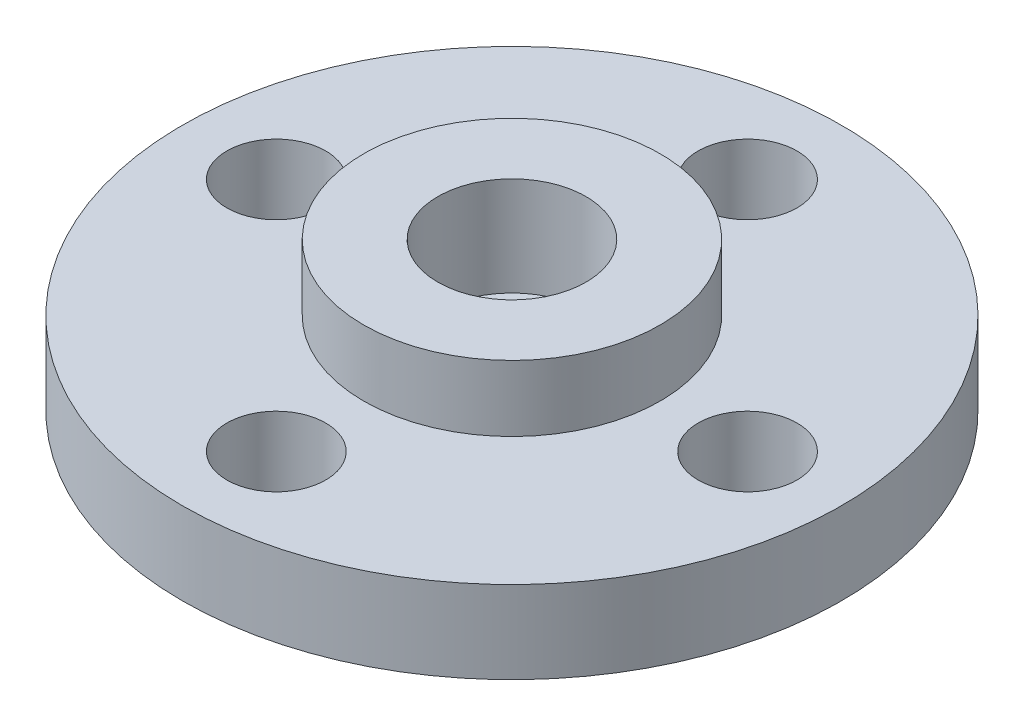
ISO-10303-21;
HEADER;
FILE_DESCRIPTION(('STEP AP214'),'2;1');
FILE_NAME('part.step','',(''),(''),'','','');
FILE_SCHEMA(('AUTOMOTIVE_DESIGN { 1 0 10303 214 1 1 1 1 }'));
ENDSEC;
DATA;
#1=APPLICATION_CONTEXT('core data for automotive mechanical design processes');
#2=APPLICATION_PROTOCOL_DEFINITION('international standard','automotive_design',2000,#1);
#3=PRODUCT_CONTEXT('',#1,'mechanical');
#4=PRODUCT('Part','Part','',(#3));
#5=PRODUCT_RELATED_PRODUCT_CATEGORY('part','',(#4));
#6=PRODUCT_DEFINITION_FORMATION('','',#4);
#7=PRODUCT_DEFINITION_CONTEXT('part definition',#1,'design');
#8=PRODUCT_DEFINITION('design','',#6,#7);
#9=PRODUCT_DEFINITION_SHAPE('','',#8);
#10=(LENGTH_UNIT() NAMED_UNIT(*) SI_UNIT(.MILLI.,.METRE.));
#11=(NAMED_UNIT(*) PLANE_ANGLE_UNIT() SI_UNIT($,.RADIAN.));
#12=(NAMED_UNIT(*) SI_UNIT($,.STERADIAN.) SOLID_ANGLE_UNIT());
#13=UNCERTAINTY_MEASURE_WITH_UNIT(LENGTH_MEASURE(1.E-05),#10,'distance_accuracy_value','');
#14=(GEOMETRIC_REPRESENTATION_CONTEXT(3) GLOBAL_UNCERTAINTY_ASSIGNED_CONTEXT((#13)) GLOBAL_UNIT_ASSIGNED_CONTEXT((#10,
#11,#12)) REPRESENTATION_CONTEXT('',''));
#15=CARTESIAN_POINT('',(0.,0.,0.));
#16=DIRECTION('',(0.,0.,1.));
#17=DIRECTION('',(1.,0.,0.));
#18=AXIS2_PLACEMENT_3D('',#15,#16,#17);
#19=CARTESIAN_POINT('',(0.,2.5,0.));
#20=DIRECTION('',(0.,-1.,0.));
#21=DIRECTION('',(0.,0.,-1.));
#22=AXIS2_PLACEMENT_3D('',#19,#20,#21);
#23=CYLINDRICAL_SURFACE('',#22,1.5);
#24=CARTESIAN_POINT('',(0.,0.,0.));
#25=DIRECTION('',(0.,1.,0.));
#26=DIRECTION('',(0.,0.,1.));
#27=AXIS2_PLACEMENT_3D('',#24,#25,#26);
#28=CIRCLE('',#27,1.5);
#29=CARTESIAN_POINT('',(0.,0.,1.5));
#30=VERTEX_POINT('',#29);
#31=EDGE_CURVE('E58',#30,#30,#28,.T.);
#32=ORIENTED_EDGE('',*,*,#31,.F.);
#33=EDGE_LOOP('',(#32));
#34=FACE_BOUND('',#33,.T.);
#35=CARTESIAN_POINT('',(0.,1.5,0.));
#36=DIRECTION('',(0.,1.,0.));
#37=DIRECTION('',(0.,0.,1.));
#38=AXIS2_PLACEMENT_3D('',#35,#36,#37);
#39=CIRCLE('',#38,1.5);
#40=CARTESIAN_POINT('',(0.,1.5,1.5));
#41=VERTEX_POINT('',#40);
#42=EDGE_CURVE('E47',#41,#41,#39,.T.);
#43=ORIENTED_EDGE('',*,*,#42,.T.);
#44=EDGE_LOOP('',(#43));
#45=FACE_BOUND('',#44,.T.);
#46=ADVANCED_FACE('F43',(#34,#45),#23,.F.);
#47=CARTESIAN_POINT('',(0.,2.5,0.));
#48=DIRECTION('',(0.,1.,0.));
#49=DIRECTION('',(0.,0.,1.));
#50=AXIS2_PLACEMENT_3D('',#47,#48,#49);
#51=PLANE('',#50);
#52=CARTESIAN_POINT('',(0.,2.5,0.));
#53=DIRECTION('',(0.,1.,0.));
#54=DIRECTION('',(0.,0.,1.));
#55=AXIS2_PLACEMENT_3D('',#52,#53,#54);
#56=CIRCLE('',#55,4.5);
#57=CARTESIAN_POINT('',(0.,2.5,4.5));
#58=VERTEX_POINT('',#57);
#59=EDGE_CURVE('E96',#58,#58,#56,.T.);
#60=ORIENTED_EDGE('',*,*,#59,.F.);
#61=EDGE_LOOP('',(#60));
#62=FACE_BOUND('',#61,.T.);
#63=CARTESIAN_POINT('',(0.,2.5,7.15));
#64=DIRECTION('',(0.,1.,0.));
#65=DIRECTION('',(0.,0.,1.));
#66=AXIS2_PLACEMENT_3D('',#63,#64,#65);
#67=CIRCLE('',#66,1.5);
#68=CARTESIAN_POINT('',(0.,2.5,8.65));
#69=VERTEX_POINT('',#68);
#70=EDGE_CURVE('E76',#69,#69,#67,.T.);
#71=ORIENTED_EDGE('',*,*,#70,.F.);
#72=EDGE_LOOP('',(#71));
#73=FACE_BOUND('',#72,.T.);
#74=CARTESIAN_POINT('',(0.,2.5,-7.15));
#75=DIRECTION('',(0.,1.,0.));
#76=DIRECTION('',(0.,0.,1.));
#77=AXIS2_PLACEMENT_3D('',#74,#75,#76);
#78=CIRCLE('',#77,1.5);
#79=CARTESIAN_POINT('',(0.,2.5,-5.65));
#80=VERTEX_POINT('',#79);
#81=EDGE_CURVE('E63',#80,#80,#78,.T.);
#82=ORIENTED_EDGE('',*,*,#81,.F.);
#83=EDGE_LOOP('',(#82));
#84=FACE_BOUND('',#83,.T.);
#85=CARTESIAN_POINT('',(0.,2.5,0.));
#86=DIRECTION('',(0.,1.,0.));
#87=DIRECTION('',(0.,0.,1.));
#88=AXIS2_PLACEMENT_3D('',#85,#86,#87);
#89=CIRCLE('',#88,10.);
#90=CARTESIAN_POINT('',(0.,2.5,10.));
#91=VERTEX_POINT('',#90);
#92=EDGE_CURVE('E10',#91,#91,#89,.T.);
#93=ORIENTED_EDGE('',*,*,#92,.T.);
#94=EDGE_LOOP('',(#93));
#95=FACE_BOUND('',#94,.T.);
#96=CARTESIAN_POINT('',(7.15,2.5,0.));
#97=DIRECTION('',(0.,1.,0.));
#98=DIRECTION('',(0.,0.,1.));
#99=AXIS2_PLACEMENT_3D('',#96,#97,#98);
#100=CIRCLE('',#99,1.5);
#101=CARTESIAN_POINT('',(7.15,2.5,1.50000000000002));
#102=VERTEX_POINT('',#101);
#103=EDGE_CURVE('E68',#102,#102,#100,.T.);
#104=ORIENTED_EDGE('',*,*,#103,.F.);
#105=EDGE_LOOP('',(#104));
#106=FACE_BOUND('',#105,.T.);
#107=CARTESIAN_POINT('',(-7.15,2.5,0.));
#108=DIRECTION('',(0.,1.,0.));
#109=DIRECTION('',(0.,0.,1.));
#110=AXIS2_PLACEMENT_3D('',#107,#108,#109);
#111=CIRCLE('',#110,1.5);
#112=CARTESIAN_POINT('',(-7.15,2.5,1.49999999999993));
#113=VERTEX_POINT('',#112);
#114=EDGE_CURVE('E84',#113,#113,#111,.T.);
#115=ORIENTED_EDGE('',*,*,#114,.F.);
#116=EDGE_LOOP('',(#115));
#117=FACE_BOUND('',#116,.T.);
#118=ADVANCED_FACE('F128',(#62,#73,#84,#95,#106,#117),#51,.T.);
#119=CARTESIAN_POINT('',(0.,0.,0.));
#120=DIRECTION('',(0.,1.,0.));
#121=DIRECTION('',(0.,0.,1.));
#122=AXIS2_PLACEMENT_3D('',#119,#120,#121);
#123=PLANE('',#122);
#124=CARTESIAN_POINT('',(0.,0.,0.));
#125=DIRECTION('',(0.,1.,0.));
#126=DIRECTION('',(0.,0.,1.));
#127=AXIS2_PLACEMENT_3D('',#124,#125,#126);
#128=CIRCLE('',#127,10.);
#129=CARTESIAN_POINT('',(0.,0.,10.));
#130=VERTEX_POINT('',#129);
#131=EDGE_CURVE('E52',#130,#130,#128,.T.);
#132=ORIENTED_EDGE('',*,*,#131,.F.);
#133=EDGE_LOOP('',(#132));
#134=FACE_BOUND('',#133,.T.);
#135=ORIENTED_EDGE('',*,*,#31,.T.);
#136=EDGE_LOOP('',(#135));
#137=FACE_BOUND('',#136,.T.);
#138=CARTESIAN_POINT('',(0.,0.,-7.15));
#139=DIRECTION('',(0.,1.,0.));
#140=DIRECTION('',(0.,0.,1.));
#141=AXIS2_PLACEMENT_3D('',#138,#139,#140);
#142=CIRCLE('',#141,1.5);
#143=CARTESIAN_POINT('',(0.,0.,-5.65));
#144=VERTEX_POINT('',#143);
#145=EDGE_CURVE('E64',#144,#144,#142,.T.);
#146=ORIENTED_EDGE('',*,*,#145,.T.);
#147=EDGE_LOOP('',(#146));
#148=FACE_BOUND('',#147,.T.);
#149=CARTESIAN_POINT('',(7.15,0.,0.));
#150=DIRECTION('',(0.,1.,0.));
#151=DIRECTION('',(0.,0.,1.));
#152=AXIS2_PLACEMENT_3D('',#149,#150,#151);
#153=CIRCLE('',#152,1.5);
#154=CARTESIAN_POINT('',(7.15,0.,1.50000000000002));
#155=VERTEX_POINT('',#154);
#156=EDGE_CURVE('E72',#155,#155,#153,.T.);
#157=ORIENTED_EDGE('',*,*,#156,.T.);
#158=EDGE_LOOP('',(#157));
#159=FACE_BOUND('',#158,.T.);
#160=CARTESIAN_POINT('',(0.,0.,7.15));
#161=DIRECTION('',(0.,1.,0.));
#162=DIRECTION('',(0.,0.,1.));
#163=AXIS2_PLACEMENT_3D('',#160,#161,#162);
#164=CIRCLE('',#163,1.5);
#165=CARTESIAN_POINT('',(0.,0.,8.65));
#166=VERTEX_POINT('',#165);
#167=EDGE_CURVE('E80',#166,#166,#164,.T.);
#168=ORIENTED_EDGE('',*,*,#167,.T.);
#169=EDGE_LOOP('',(#168));
#170=FACE_BOUND('',#169,.T.);
#171=CARTESIAN_POINT('',(-7.15,0.,0.));
#172=DIRECTION('',(0.,1.,0.));
#173=DIRECTION('',(0.,0.,1.));
#174=AXIS2_PLACEMENT_3D('',#171,#172,#173);
#175=CIRCLE('',#174,1.5);
#176=CARTESIAN_POINT('',(-7.15,0.,1.49999999999993));
#177=VERTEX_POINT('',#176);
#178=EDGE_CURVE('E88',#177,#177,#175,.T.);
#179=ORIENTED_EDGE('',*,*,#178,.T.);
#180=EDGE_LOOP('',(#179));
#181=FACE_BOUND('',#180,.T.);
#182=ADVANCED_FACE('F136',(#134,#137,#148,#159,#170,#181),#123,.F.);
#183=CARTESIAN_POINT('',(0.,2.5,0.));
#184=DIRECTION('',(0.,-1.,0.));
#185=DIRECTION('',(0.,0.,-1.));
#186=AXIS2_PLACEMENT_3D('',#183,#184,#185);
#187=CYLINDRICAL_SURFACE('',#186,10.);
#188=ORIENTED_EDGE('',*,*,#92,.F.);
#189=EDGE_LOOP('',(#188));
#190=FACE_BOUND('',#189,.T.);
#191=ORIENTED_EDGE('',*,*,#131,.T.);
#192=EDGE_LOOP('',(#191));
#193=FACE_BOUND('',#192,.T.);
#194=ADVANCED_FACE('F45',(#190,#193),#187,.T.);
#195=CARTESIAN_POINT('',(0.,2.5,-7.15));
#196=DIRECTION('',(0.,-1.,0.));
#197=DIRECTION('',(0.,0.,-1.));
#198=AXIS2_PLACEMENT_3D('',#195,#196,#197);
#199=CYLINDRICAL_SURFACE('',#198,1.5);
#200=ORIENTED_EDGE('',*,*,#81,.T.);
#201=EDGE_LOOP('',(#200));
#202=FACE_BOUND('',#201,.T.);
#203=ORIENTED_EDGE('',*,*,#145,.F.);
#204=EDGE_LOOP('',(#203));
#205=FACE_BOUND('',#204,.T.);
#206=ADVANCED_FACE('F141',(#202,#205),#199,.F.);
#207=CARTESIAN_POINT('',(7.15,2.5,0.));
#208=DIRECTION('',(0.,-1.,0.));
#209=DIRECTION('',(0.,0.,-1.));
#210=AXIS2_PLACEMENT_3D('',#207,#208,#209);
#211=CYLINDRICAL_SURFACE('',#210,1.5);
#212=ORIENTED_EDGE('',*,*,#103,.T.);
#213=EDGE_LOOP('',(#212));
#214=FACE_BOUND('',#213,.T.);
#215=ORIENTED_EDGE('',*,*,#156,.F.);
#216=EDGE_LOOP('',(#215));
#217=FACE_BOUND('',#216,.T.);
#218=ADVANCED_FACE('F171',(#214,#217),#211,.F.);
#219=CARTESIAN_POINT('',(0.,2.5,7.15));
#220=DIRECTION('',(0.,-1.,0.));
#221=DIRECTION('',(0.,0.,-1.));
#222=AXIS2_PLACEMENT_3D('',#219,#220,#221);
#223=CYLINDRICAL_SURFACE('',#222,1.5);
#224=ORIENTED_EDGE('',*,*,#70,.T.);
#225=EDGE_LOOP('',(#224));
#226=FACE_BOUND('',#225,.T.);
#227=ORIENTED_EDGE('',*,*,#167,.F.);
#228=EDGE_LOOP('',(#227));
#229=FACE_BOUND('',#228,.T.);
#230=ADVANCED_FACE('F163',(#226,#229),#223,.F.);
#231=CARTESIAN_POINT('',(-7.15,2.5,0.));
#232=DIRECTION('',(0.,-1.,0.));
#233=DIRECTION('',(0.,0.,-1.));
#234=AXIS2_PLACEMENT_3D('',#231,#232,#233);
#235=CYLINDRICAL_SURFACE('',#234,1.5);
#236=ORIENTED_EDGE('',*,*,#114,.T.);
#237=EDGE_LOOP('',(#236));
#238=FACE_BOUND('',#237,.T.);
#239=ORIENTED_EDGE('',*,*,#178,.F.);
#240=EDGE_LOOP('',(#239));
#241=FACE_BOUND('',#240,.T.);
#242=ADVANCED_FACE('F160',(#238,#241),#235,.F.);
#243=CARTESIAN_POINT('',(0.,4.5,0.));
#244=DIRECTION('',(0.,-1.,0.));
#245=DIRECTION('',(0.,0.,-1.));
#246=AXIS2_PLACEMENT_3D('',#243,#244,#245);
#247=CYLINDRICAL_SURFACE('',#246,4.5);
#248=CARTESIAN_POINT('',(0.,4.5,0.));
#249=DIRECTION('',(0.,1.,0.));
#250=DIRECTION('',(0.,0.,1.));
#251=AXIS2_PLACEMENT_3D('',#248,#249,#250);
#252=CIRCLE('',#251,4.5);
#253=CARTESIAN_POINT('',(0.,4.5,4.5));
#254=VERTEX_POINT('',#253);
#255=EDGE_CURVE('E92',#254,#254,#252,.T.);
#256=ORIENTED_EDGE('',*,*,#255,.F.);
#257=EDGE_LOOP('',(#256));
#258=FACE_BOUND('',#257,.T.);
#259=ORIENTED_EDGE('',*,*,#59,.T.);
#260=EDGE_LOOP('',(#259));
#261=FACE_BOUND('',#260,.T.);
#262=ADVANCED_FACE('F162',(#258,#261),#247,.T.);
#263=CARTESIAN_POINT('',(0.,4.5,0.));
#264=DIRECTION('',(0.,1.,0.));
#265=DIRECTION('',(0.,0.,1.));
#266=AXIS2_PLACEMENT_3D('',#263,#264,#265);
#267=PLANE('',#266);
#268=CARTESIAN_POINT('',(0.,4.5,0.));
#269=DIRECTION('',(0.,1.,0.));
#270=DIRECTION('',(0.,0.,1.));
#271=AXIS2_PLACEMENT_3D('',#268,#269,#270);
#272=CIRCLE('',#271,2.25);
#273=CARTESIAN_POINT('',(0.,4.5,2.25));
#274=VERTEX_POINT('',#273);
#275=EDGE_CURVE('E103',#274,#274,#272,.T.);
#276=ORIENTED_EDGE('',*,*,#275,.F.);
#277=EDGE_LOOP('',(#276));
#278=FACE_BOUND('',#277,.T.);
#279=ORIENTED_EDGE('',*,*,#255,.T.);
#280=EDGE_LOOP('',(#279));
#281=FACE_BOUND('',#280,.T.);
#282=ADVANCED_FACE('F124',(#278,#281),#267,.T.);
#283=CARTESIAN_POINT('',(0.,1.5,0.));
#284=DIRECTION('',(0.,1.,0.));
#285=DIRECTION('',(0.,0.,1.));
#286=AXIS2_PLACEMENT_3D('',#283,#284,#285);
#287=CYLINDRICAL_SURFACE('',#286,2.25);
#288=CARTESIAN_POINT('',(0.,1.5,0.));
#289=DIRECTION('',(0.,1.,0.));
#290=DIRECTION('',(0.,0.,1.));
#291=AXIS2_PLACEMENT_3D('',#288,#289,#290);
#292=CIRCLE('',#291,2.25);
#293=CARTESIAN_POINT('',(0.,1.5,2.25));
#294=VERTEX_POINT('',#293);
#295=EDGE_CURVE('E107',#294,#294,#292,.T.);
#296=ORIENTED_EDGE('',*,*,#295,.F.);
#297=EDGE_LOOP('',(#296));
#298=FACE_BOUND('',#297,.T.);
#299=ORIENTED_EDGE('',*,*,#275,.T.);
#300=EDGE_LOOP('',(#299));
#301=FACE_BOUND('',#300,.T.);
#302=ADVANCED_FACE('F119',(#298,#301),#287,.F.);
#303=CARTESIAN_POINT('',(0.,1.5,0.));
#304=DIRECTION('',(0.,1.,0.));
#305=DIRECTION('',(0.,0.,1.));
#306=AXIS2_PLACEMENT_3D('',#303,#304,#305);
#307=PLANE('',#306);
#308=ORIENTED_EDGE('',*,*,#42,.F.);
#309=EDGE_LOOP('',(#308));
#310=FACE_BOUND('',#309,.T.);
#311=ORIENTED_EDGE('',*,*,#295,.T.);
#312=EDGE_LOOP('',(#311));
#313=FACE_BOUND('',#312,.T.);
#314=ADVANCED_FACE('F117',(#310,#313),#307,.T.);
#315=CLOSED_SHELL('',(#46,#118,#182,#194,#206,#218,#230,#242,#262,#282,#302,#314));
#316=MANIFOLD_SOLID_BREP('B2',#315);
#317=ADVANCED_BREP_SHAPE_REPRESENTATION('',(#18,#316),#14);
#318=SHAPE_DEFINITION_REPRESENTATION(#9,#317);
ENDSEC;
END-ISO-10303-21;
